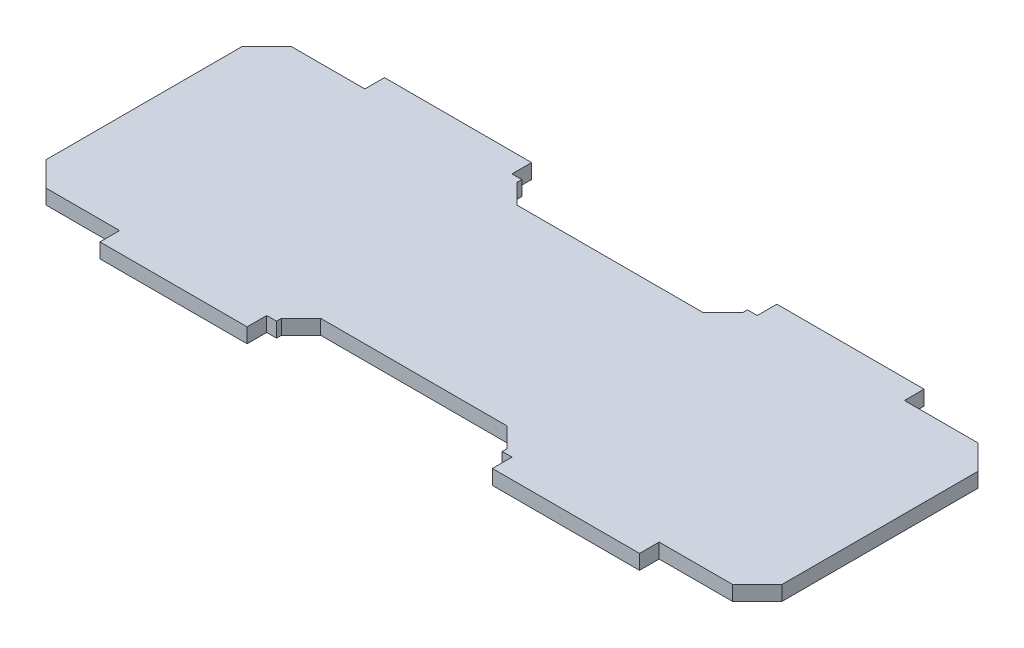
ISO-10303-21;
HEADER;
FILE_DESCRIPTION(('STEP AP214'),'2;1');
FILE_NAME('part.step','',(''),(''),'','','');
FILE_SCHEMA(('AUTOMOTIVE_DESIGN { 1 0 10303 214 1 1 1 1 }'));
ENDSEC;
DATA;
#1=APPLICATION_CONTEXT('core data for automotive mechanical design processes');
#2=APPLICATION_PROTOCOL_DEFINITION('international standard','automotive_design',2000,#1);
#3=PRODUCT_CONTEXT('',#1,'mechanical');
#4=PRODUCT('Part','Part','',(#3));
#5=PRODUCT_RELATED_PRODUCT_CATEGORY('part','',(#4));
#6=PRODUCT_DEFINITION_FORMATION('','',#4);
#7=PRODUCT_DEFINITION_CONTEXT('part definition',#1,'design');
#8=PRODUCT_DEFINITION('design','',#6,#7);
#9=PRODUCT_DEFINITION_SHAPE('','',#8);
#10=(LENGTH_UNIT() NAMED_UNIT(*) SI_UNIT(.MILLI.,.METRE.));
#11=(NAMED_UNIT(*) PLANE_ANGLE_UNIT() SI_UNIT($,.RADIAN.));
#12=(NAMED_UNIT(*) SI_UNIT($,.STERADIAN.) SOLID_ANGLE_UNIT());
#13=UNCERTAINTY_MEASURE_WITH_UNIT(LENGTH_MEASURE(1.E-05),#10,'distance_accuracy_value','');
#14=(GEOMETRIC_REPRESENTATION_CONTEXT(3) GLOBAL_UNCERTAINTY_ASSIGNED_CONTEXT((#13)) GLOBAL_UNIT_ASSIGNED_CONTEXT((#10,
#11,#12)) REPRESENTATION_CONTEXT('',''));
#15=CARTESIAN_POINT('',(0.,0.,0.));
#16=DIRECTION('',(0.,0.,1.));
#17=DIRECTION('',(1.,0.,0.));
#18=AXIS2_PLACEMENT_3D('',#15,#16,#17);
#19=CARTESIAN_POINT('',(-55.,3.,-25.));
#20=DIRECTION('',(1.,0.,0.));
#21=DIRECTION('',(0.,0.,-1.));
#22=AXIS2_PLACEMENT_3D('',#19,#20,#21);
#23=PLANE('',#22);
#24=DIRECTION('',(0.,0.,1.));
#25=VECTOR('',#24,1.);
#26=CARTESIAN_POINT('',(-55.,0.,-25.));
#27=LINE('',#26,#25);
#28=CARTESIAN_POINT('',(-55.,0.,-29.));
#29=VERTEX_POINT('',#28);
#30=CARTESIAN_POINT('',(-55.,0.,-25.));
#31=VERTEX_POINT('',#30);
#32=EDGE_CURVE('E312',#29,#31,#27,.T.);
#33=ORIENTED_EDGE('',*,*,#32,.T.);
#34=DIRECTION('',(0.,-1.,0.));
#35=VECTOR('',#34,1.);
#36=CARTESIAN_POINT('',(-55.,3.,-25.));
#37=LINE('',#36,#35);
#38=CARTESIAN_POINT('',(-55.,3.,-25.));
#39=VERTEX_POINT('',#38);
#40=EDGE_CURVE('E11',#39,#31,#37,.T.);
#41=ORIENTED_EDGE('',*,*,#40,.F.);
#42=DIRECTION('',(0.,0.,1.));
#43=VECTOR('',#42,1.);
#44=CARTESIAN_POINT('',(-55.,3.,-25.));
#45=LINE('',#44,#43);
#46=CARTESIAN_POINT('',(-55.,3.,-29.));
#47=VERTEX_POINT('',#46);
#48=EDGE_CURVE('E418',#47,#39,#45,.T.);
#49=ORIENTED_EDGE('',*,*,#48,.F.);
#50=DIRECTION('',(0.,-1.,0.));
#51=VECTOR('',#50,1.);
#52=CARTESIAN_POINT('',(-55.,3.,-29.));
#53=LINE('',#52,#51);
#54=EDGE_CURVE('E308',#47,#29,#53,.T.);
#55=ORIENTED_EDGE('',*,*,#54,.T.);
#56=EDGE_LOOP('',(#33,#41,#49,#55));
#57=FACE_BOUND('',#56,.T.);
#58=ADVANCED_FACE('F43',(#57),#23,.F.);
#59=CARTESIAN_POINT('',(-70.,3.,-25.));
#60=DIRECTION('',(0.,0.,1.));
#61=DIRECTION('',(1.,0.,0.));
#62=AXIS2_PLACEMENT_3D('',#59,#60,#61);
#63=PLANE('',#62);
#64=DIRECTION('',(-1.,0.,0.));
#65=VECTOR('',#64,1.);
#66=CARTESIAN_POINT('',(-70.,0.,-25.));
#67=LINE('',#66,#65);
#68=CARTESIAN_POINT('',(-70.,0.,-25.));
#69=VERTEX_POINT('',#68);
#70=EDGE_CURVE('E316',#31,#69,#67,.T.);
#71=ORIENTED_EDGE('',*,*,#70,.T.);
#72=DIRECTION('',(0.,-1.,0.));
#73=VECTOR('',#72,1.);
#74=CARTESIAN_POINT('',(-70.,3.,-25.));
#75=LINE('',#74,#73);
#76=CARTESIAN_POINT('',(-70.,3.,-25.));
#77=VERTEX_POINT('',#76);
#78=EDGE_CURVE('E52',#77,#69,#75,.T.);
#79=ORIENTED_EDGE('',*,*,#78,.F.);
#80=DIRECTION('',(-1.,0.,0.));
#81=VECTOR('',#80,1.);
#82=CARTESIAN_POINT('',(-70.,3.,-25.));
#83=LINE('',#82,#81);
#84=EDGE_CURVE('E187',#39,#77,#83,.T.);
#85=ORIENTED_EDGE('',*,*,#84,.F.);
#86=ORIENTED_EDGE('',*,*,#40,.T.);
#87=EDGE_LOOP('',(#71,#79,#85,#86));
#88=FACE_BOUND('',#87,.T.);
#89=ADVANCED_FACE('F680',(#88),#63,.F.);
#90=CARTESIAN_POINT('',(-75.,3.,-20.));
#91=DIRECTION('',(0.707106781186547,0.,0.707106781186548));
#92=DIRECTION('',(0.707106781186548,0.,-0.707106781186547));
#93=AXIS2_PLACEMENT_3D('',#90,#91,#92);
#94=PLANE('',#93);
#95=DIRECTION('',(-0.707106781186548,0.,0.707106781186547));
#96=VECTOR('',#95,1.);
#97=CARTESIAN_POINT('',(-75.,0.,-20.));
#98=LINE('',#97,#96);
#99=CARTESIAN_POINT('',(-75.,0.,-20.));
#100=VERTEX_POINT('',#99);
#101=EDGE_CURVE('E319',#69,#100,#98,.T.);
#102=ORIENTED_EDGE('',*,*,#101,.T.);
#103=DIRECTION('',(0.,-1.,0.));
#104=VECTOR('',#103,1.);
#105=CARTESIAN_POINT('',(-75.,3.,-20.));
#106=LINE('',#105,#104);
#107=CARTESIAN_POINT('',(-75.,3.,-20.));
#108=VERTEX_POINT('',#107);
#109=EDGE_CURVE('E541',#108,#100,#106,.T.);
#110=ORIENTED_EDGE('',*,*,#109,.F.);
#111=DIRECTION('',(-0.707106781186548,0.,0.707106781186547));
#112=VECTOR('',#111,1.);
#113=CARTESIAN_POINT('',(-75.,3.,-20.));
#114=LINE('',#113,#112);
#115=EDGE_CURVE('E551',#77,#108,#114,.T.);
#116=ORIENTED_EDGE('',*,*,#115,.F.);
#117=ORIENTED_EDGE('',*,*,#78,.T.);
#118=EDGE_LOOP('',(#102,#110,#116,#117));
#119=FACE_BOUND('',#118,.T.);
#120=ADVANCED_FACE('F549',(#119),#94,.F.);
#121=CARTESIAN_POINT('',(-75.,3.,20.));
#122=DIRECTION('',(1.,0.,0.));
#123=DIRECTION('',(0.,0.,-1.));
#124=AXIS2_PLACEMENT_3D('',#121,#122,#123);
#125=PLANE('',#124);
#126=DIRECTION('',(0.,0.,1.));
#127=VECTOR('',#126,1.);
#128=CARTESIAN_POINT('',(-75.,0.,20.));
#129=LINE('',#128,#127);
#130=CARTESIAN_POINT('',(-75.,0.,20.));
#131=VERTEX_POINT('',#130);
#132=EDGE_CURVE('E322',#100,#131,#129,.T.);
#133=ORIENTED_EDGE('',*,*,#132,.T.);
#134=DIRECTION('',(0.,-1.,0.));
#135=VECTOR('',#134,1.);
#136=CARTESIAN_POINT('',(-75.,3.,20.));
#137=LINE('',#136,#135);
#138=CARTESIAN_POINT('',(-75.,3.,20.));
#139=VERTEX_POINT('',#138);
#140=EDGE_CURVE('E537',#139,#131,#137,.T.);
#141=ORIENTED_EDGE('',*,*,#140,.F.);
#142=DIRECTION('',(0.,0.,1.));
#143=VECTOR('',#142,1.);
#144=CARTESIAN_POINT('',(-75.,3.,20.));
#145=LINE('',#144,#143);
#146=EDGE_CURVE('E570',#108,#139,#145,.T.);
#147=ORIENTED_EDGE('',*,*,#146,.F.);
#148=ORIENTED_EDGE('',*,*,#109,.T.);
#149=EDGE_LOOP('',(#133,#141,#147,#148));
#150=FACE_BOUND('',#149,.T.);
#151=ADVANCED_FACE('F560',(#150),#125,.F.);
#152=CARTESIAN_POINT('',(-75.,3.,20.));
#153=DIRECTION('',(0.707106781186547,0.,-0.707106781186548));
#154=DIRECTION('',(-0.707106781186548,0.,-0.707106781186547));
#155=AXIS2_PLACEMENT_3D('',#152,#153,#154);
#156=PLANE('',#155);
#157=DIRECTION('',(0.707106781186548,0.,0.707106781186547));
#158=VECTOR('',#157,1.);
#159=CARTESIAN_POINT('',(-75.,0.,20.));
#160=LINE('',#159,#158);
#161=CARTESIAN_POINT('',(-70.,0.,25.));
#162=VERTEX_POINT('',#161);
#163=EDGE_CURVE('E325',#131,#162,#160,.T.);
#164=ORIENTED_EDGE('',*,*,#163,.T.);
#165=DIRECTION('',(0.,-1.,0.));
#166=VECTOR('',#165,1.);
#167=CARTESIAN_POINT('',(-70.,3.,25.));
#168=LINE('',#167,#166);
#169=CARTESIAN_POINT('',(-70.,3.,25.));
#170=VERTEX_POINT('',#169);
#171=EDGE_CURVE('E533',#170,#162,#168,.T.);
#172=ORIENTED_EDGE('',*,*,#171,.F.);
#173=DIRECTION('',(0.707106781186548,0.,0.707106781186547));
#174=VECTOR('',#173,1.);
#175=CARTESIAN_POINT('',(-75.,3.,20.));
#176=LINE('',#175,#174);
#177=EDGE_CURVE('E566',#139,#170,#176,.T.);
#178=ORIENTED_EDGE('',*,*,#177,.F.);
#179=ORIENTED_EDGE('',*,*,#140,.T.);
#180=EDGE_LOOP('',(#164,#172,#178,#179));
#181=FACE_BOUND('',#180,.T.);
#182=ADVANCED_FACE('F564',(#181),#156,.F.);
#183=CARTESIAN_POINT('',(-70.,3.,25.));
#184=DIRECTION('',(0.,0.,-1.));
#185=DIRECTION('',(-1.,0.,0.));
#186=AXIS2_PLACEMENT_3D('',#183,#184,#185);
#187=PLANE('',#186);
#188=DIRECTION('',(1.,0.,0.));
#189=VECTOR('',#188,1.);
#190=CARTESIAN_POINT('',(-70.,0.,25.));
#191=LINE('',#190,#189);
#192=CARTESIAN_POINT('',(-55.,0.,25.));
#193=VERTEX_POINT('',#192);
#194=EDGE_CURVE('E328',#162,#193,#191,.T.);
#195=ORIENTED_EDGE('',*,*,#194,.T.);
#196=DIRECTION('',(0.,-1.,0.));
#197=VECTOR('',#196,1.);
#198=CARTESIAN_POINT('',(-55.,3.,25.));
#199=LINE('',#198,#197);
#200=CARTESIAN_POINT('',(-55.,3.,25.));
#201=VERTEX_POINT('',#200);
#202=EDGE_CURVE('E529',#201,#193,#199,.T.);
#203=ORIENTED_EDGE('',*,*,#202,.F.);
#204=DIRECTION('',(1.,0.,0.));
#205=VECTOR('',#204,1.);
#206=CARTESIAN_POINT('',(-70.,3.,25.));
#207=LINE('',#206,#205);
#208=EDGE_CURVE('E569',#170,#201,#207,.T.);
#209=ORIENTED_EDGE('',*,*,#208,.F.);
#210=ORIENTED_EDGE('',*,*,#171,.T.);
#211=EDGE_LOOP('',(#195,#203,#209,#210));
#212=FACE_BOUND('',#211,.T.);
#213=ADVANCED_FACE('F693',(#212),#187,.F.);
#214=CARTESIAN_POINT('',(-55.,3.,25.));
#215=DIRECTION('',(1.,0.,0.));
#216=DIRECTION('',(0.,0.,-1.));
#217=AXIS2_PLACEMENT_3D('',#214,#215,#216);
#218=PLANE('',#217);
#219=DIRECTION('',(0.,0.,1.));
#220=VECTOR('',#219,1.);
#221=CARTESIAN_POINT('',(-55.,0.,25.));
#222=LINE('',#221,#220);
#223=CARTESIAN_POINT('',(-55.,0.,29.));
#224=VERTEX_POINT('',#223);
#225=EDGE_CURVE('E331',#193,#224,#222,.T.);
#226=ORIENTED_EDGE('',*,*,#225,.T.);
#227=DIRECTION('',(0.,-1.,0.));
#228=VECTOR('',#227,1.);
#229=CARTESIAN_POINT('',(-55.,3.,29.));
#230=LINE('',#229,#228);
#231=CARTESIAN_POINT('',(-55.,3.,29.));
#232=VERTEX_POINT('',#231);
#233=EDGE_CURVE('E525',#232,#224,#230,.T.);
#234=ORIENTED_EDGE('',*,*,#233,.F.);
#235=DIRECTION('',(0.,0.,1.));
#236=VECTOR('',#235,1.);
#237=CARTESIAN_POINT('',(-55.,3.,25.));
#238=LINE('',#237,#236);
#239=EDGE_CURVE('E574',#201,#232,#238,.T.);
#240=ORIENTED_EDGE('',*,*,#239,.F.);
#241=ORIENTED_EDGE('',*,*,#202,.T.);
#242=EDGE_LOOP('',(#226,#234,#240,#241));
#243=FACE_BOUND('',#242,.T.);
#244=ADVANCED_FACE('F696',(#243),#218,.F.);
#245=CARTESIAN_POINT('',(-55.,3.,29.));
#246=DIRECTION('',(0.,0.,-1.));
#247=DIRECTION('',(-1.,0.,0.));
#248=AXIS2_PLACEMENT_3D('',#245,#246,#247);
#249=PLANE('',#248);
#250=DIRECTION('',(1.,0.,0.));
#251=VECTOR('',#250,1.);
#252=CARTESIAN_POINT('',(-55.,0.,29.));
#253=LINE('',#252,#251);
#254=CARTESIAN_POINT('',(-25.,0.,29.));
#255=VERTEX_POINT('',#254);
#256=EDGE_CURVE('E334',#224,#255,#253,.T.);
#257=ORIENTED_EDGE('',*,*,#256,.T.);
#258=DIRECTION('',(0.,-1.,0.));
#259=VECTOR('',#258,1.);
#260=CARTESIAN_POINT('',(-25.,3.,29.));
#261=LINE('',#260,#259);
#262=CARTESIAN_POINT('',(-25.,3.,29.));
#263=VERTEX_POINT('',#262);
#264=EDGE_CURVE('E521',#263,#255,#261,.T.);
#265=ORIENTED_EDGE('',*,*,#264,.F.);
#266=DIRECTION('',(1.,0.,0.));
#267=VECTOR('',#266,1.);
#268=CARTESIAN_POINT('',(-55.,3.,29.));
#269=LINE('',#268,#267);
#270=EDGE_CURVE('E581',#232,#263,#269,.T.);
#271=ORIENTED_EDGE('',*,*,#270,.F.);
#272=ORIENTED_EDGE('',*,*,#233,.T.);
#273=EDGE_LOOP('',(#257,#265,#271,#272));
#274=FACE_BOUND('',#273,.T.);
#275=ADVANCED_FACE('F700',(#274),#249,.F.);
#276=CARTESIAN_POINT('',(-25.,3.,25.));
#277=DIRECTION('',(-1.,0.,0.));
#278=DIRECTION('',(0.,0.,1.));
#279=AXIS2_PLACEMENT_3D('',#276,#277,#278);
#280=PLANE('',#279);
#281=DIRECTION('',(0.,0.,-1.));
#282=VECTOR('',#281,1.);
#283=CARTESIAN_POINT('',(-25.,0.,25.));
#284=LINE('',#283,#282);
#285=CARTESIAN_POINT('',(-25.,0.,25.));
#286=VERTEX_POINT('',#285);
#287=EDGE_CURVE('E337',#255,#286,#284,.T.);
#288=ORIENTED_EDGE('',*,*,#287,.T.);
#289=DIRECTION('',(0.,-1.,0.));
#290=VECTOR('',#289,1.);
#291=CARTESIAN_POINT('',(-25.,3.,25.));
#292=LINE('',#291,#290);
#293=CARTESIAN_POINT('',(-25.,3.,25.));
#294=VERTEX_POINT('',#293);
#295=EDGE_CURVE('E517',#294,#286,#292,.T.);
#296=ORIENTED_EDGE('',*,*,#295,.F.);
#297=DIRECTION('',(0.,0.,-1.));
#298=VECTOR('',#297,1.);
#299=CARTESIAN_POINT('',(-25.,3.,25.));
#300=LINE('',#299,#298);
#301=EDGE_CURVE('E584',#263,#294,#300,.T.);
#302=ORIENTED_EDGE('',*,*,#301,.F.);
#303=ORIENTED_EDGE('',*,*,#264,.T.);
#304=EDGE_LOOP('',(#288,#296,#302,#303));
#305=FACE_BOUND('',#304,.T.);
#306=ADVANCED_FACE('F704',(#305),#280,.F.);
#307=CARTESIAN_POINT('',(-25.,3.,25.));
#308=DIRECTION('',(0.,0.,-1.));
#309=DIRECTION('',(-1.,0.,0.));
#310=AXIS2_PLACEMENT_3D('',#307,#308,#309);
#311=PLANE('',#310);
#312=DIRECTION('',(1.,0.,0.));
#313=VECTOR('',#312,1.);
#314=CARTESIAN_POINT('',(-25.,0.,25.));
#315=LINE('',#314,#313);
#316=CARTESIAN_POINT('',(-23.,0.,25.));
#317=VERTEX_POINT('',#316);
#318=EDGE_CURVE('E340',#286,#317,#315,.T.);
#319=ORIENTED_EDGE('',*,*,#318,.T.);
#320=DIRECTION('',(0.,-1.,0.));
#321=VECTOR('',#320,1.);
#322=CARTESIAN_POINT('',(-23.,3.,25.));
#323=LINE('',#322,#321);
#324=CARTESIAN_POINT('',(-23.,3.,25.));
#325=VERTEX_POINT('',#324);
#326=EDGE_CURVE('E513',#325,#317,#323,.T.);
#327=ORIENTED_EDGE('',*,*,#326,.F.);
#328=DIRECTION('',(1.,0.,0.));
#329=VECTOR('',#328,1.);
#330=CARTESIAN_POINT('',(-25.,3.,25.));
#331=LINE('',#330,#329);
#332=EDGE_CURVE('E587',#294,#325,#331,.T.);
#333=ORIENTED_EDGE('',*,*,#332,.F.);
#334=ORIENTED_EDGE('',*,*,#295,.T.);
#335=EDGE_LOOP('',(#319,#327,#333,#334));
#336=FACE_BOUND('',#335,.T.);
#337=ADVANCED_FACE('F708',(#336),#311,.F.);
#338=CARTESIAN_POINT('',(-23.,3.,25.));
#339=DIRECTION('',(-1.,0.,0.));
#340=DIRECTION('',(0.,0.,1.));
#341=AXIS2_PLACEMENT_3D('',#338,#339,#340);
#342=PLANE('',#341);
#343=DIRECTION('',(0.,0.,-1.));
#344=VECTOR('',#343,1.);
#345=CARTESIAN_POINT('',(-23.,0.,25.));
#346=LINE('',#345,#344);
#347=CARTESIAN_POINT('',(-23.,0.,24.));
#348=VERTEX_POINT('',#347);
#349=EDGE_CURVE('E343',#317,#348,#346,.T.);
#350=ORIENTED_EDGE('',*,*,#349,.T.);
#351=DIRECTION('',(0.,-1.,0.));
#352=VECTOR('',#351,1.);
#353=CARTESIAN_POINT('',(-23.,3.,24.));
#354=LINE('',#353,#352);
#355=CARTESIAN_POINT('',(-23.,3.,24.));
#356=VERTEX_POINT('',#355);
#357=EDGE_CURVE('E509',#356,#348,#354,.T.);
#358=ORIENTED_EDGE('',*,*,#357,.F.);
#359=DIRECTION('',(0.,0.,-1.));
#360=VECTOR('',#359,1.);
#361=CARTESIAN_POINT('',(-23.,3.,25.));
#362=LINE('',#361,#360);
#363=EDGE_CURVE('E590',#325,#356,#362,.T.);
#364=ORIENTED_EDGE('',*,*,#363,.F.);
#365=ORIENTED_EDGE('',*,*,#326,.T.);
#366=EDGE_LOOP('',(#350,#358,#364,#365));
#367=FACE_BOUND('',#366,.T.);
#368=ADVANCED_FACE('F712',(#367),#342,.F.);
#369=CARTESIAN_POINT('',(-23.,3.,24.));
#370=DIRECTION('',(-0.707106781186547,0.,-0.707106781186547));
#371=DIRECTION('',(-0.707106781186548,0.,0.707106781186548));
#372=AXIS2_PLACEMENT_3D('',#369,#370,#371);
#373=PLANE('',#372);
#374=DIRECTION('',(0.707106781186548,0.,-0.707106781186548));
#375=VECTOR('',#374,1.);
#376=CARTESIAN_POINT('',(-23.,0.,24.));
#377=LINE('',#376,#375);
#378=CARTESIAN_POINT('',(-19.,0.,20.));
#379=VERTEX_POINT('',#378);
#380=EDGE_CURVE('E346',#348,#379,#377,.T.);
#381=ORIENTED_EDGE('',*,*,#380,.T.);
#382=DIRECTION('',(0.,-1.,0.));
#383=VECTOR('',#382,1.);
#384=CARTESIAN_POINT('',(-19.,3.,20.));
#385=LINE('',#384,#383);
#386=CARTESIAN_POINT('',(-19.,3.,20.));
#387=VERTEX_POINT('',#386);
#388=EDGE_CURVE('E505',#387,#379,#385,.T.);
#389=ORIENTED_EDGE('',*,*,#388,.F.);
#390=DIRECTION('',(0.707106781186548,0.,-0.707106781186548));
#391=VECTOR('',#390,1.);
#392=CARTESIAN_POINT('',(-23.,3.,24.));
#393=LINE('',#392,#391);
#394=EDGE_CURVE('E593',#356,#387,#393,.T.);
#395=ORIENTED_EDGE('',*,*,#394,.F.);
#396=ORIENTED_EDGE('',*,*,#357,.T.);
#397=EDGE_LOOP('',(#381,#389,#395,#396));
#398=FACE_BOUND('',#397,.T.);
#399=ADVANCED_FACE('F716',(#398),#373,.F.);
#400=CARTESIAN_POINT('',(-19.,3.,20.));
#401=DIRECTION('',(0.,0.,-1.));
#402=DIRECTION('',(-1.,0.,0.));
#403=AXIS2_PLACEMENT_3D('',#400,#401,#402);
#404=PLANE('',#403);
#405=DIRECTION('',(1.,0.,0.));
#406=VECTOR('',#405,1.);
#407=CARTESIAN_POINT('',(-19.,0.,20.));
#408=LINE('',#407,#406);
#409=CARTESIAN_POINT('',(19.,0.,20.));
#410=VERTEX_POINT('',#409);
#411=EDGE_CURVE('E349',#379,#410,#408,.T.);
#412=ORIENTED_EDGE('',*,*,#411,.T.);
#413=DIRECTION('',(0.,-1.,0.));
#414=VECTOR('',#413,1.);
#415=CARTESIAN_POINT('',(19.,3.,20.));
#416=LINE('',#415,#414);
#417=CARTESIAN_POINT('',(19.,3.,20.));
#418=VERTEX_POINT('',#417);
#419=EDGE_CURVE('E501',#418,#410,#416,.T.);
#420=ORIENTED_EDGE('',*,*,#419,.F.);
#421=DIRECTION('',(1.,0.,0.));
#422=VECTOR('',#421,1.);
#423=CARTESIAN_POINT('',(-19.,3.,20.));
#424=LINE('',#423,#422);
#425=EDGE_CURVE('E596',#387,#418,#424,.T.);
#426=ORIENTED_EDGE('',*,*,#425,.F.);
#427=ORIENTED_EDGE('',*,*,#388,.T.);
#428=EDGE_LOOP('',(#412,#420,#426,#427));
#429=FACE_BOUND('',#428,.T.);
#430=ADVANCED_FACE('F720',(#429),#404,.F.);
#431=CARTESIAN_POINT('',(19.,3.,20.));
#432=DIRECTION('',(0.707106781186547,0.,-0.707106781186548));
#433=DIRECTION('',(-0.707106781186548,0.,-0.707106781186547));
#434=AXIS2_PLACEMENT_3D('',#431,#432,#433);
#435=PLANE('',#434);
#436=DIRECTION('',(0.707106781186548,0.,0.707106781186547));
#437=VECTOR('',#436,1.);
#438=CARTESIAN_POINT('',(19.,0.,20.));
#439=LINE('',#438,#437);
#440=CARTESIAN_POINT('',(23.,0.,24.));
#441=VERTEX_POINT('',#440);
#442=EDGE_CURVE('E352',#410,#441,#439,.T.);
#443=ORIENTED_EDGE('',*,*,#442,.T.);
#444=DIRECTION('',(0.,-1.,0.));
#445=VECTOR('',#444,1.);
#446=CARTESIAN_POINT('',(23.,3.,24.));
#447=LINE('',#446,#445);
#448=CARTESIAN_POINT('',(23.,3.,24.));
#449=VERTEX_POINT('',#448);
#450=EDGE_CURVE('E497',#449,#441,#447,.T.);
#451=ORIENTED_EDGE('',*,*,#450,.F.);
#452=DIRECTION('',(0.707106781186548,0.,0.707106781186547));
#453=VECTOR('',#452,1.);
#454=CARTESIAN_POINT('',(19.,3.,20.));
#455=LINE('',#454,#453);
#456=EDGE_CURVE('E599',#418,#449,#455,.T.);
#457=ORIENTED_EDGE('',*,*,#456,.F.);
#458=ORIENTED_EDGE('',*,*,#419,.T.);
#459=EDGE_LOOP('',(#443,#451,#457,#458));
#460=FACE_BOUND('',#459,.T.);
#461=ADVANCED_FACE('F724',(#460),#435,.F.);
#462=CARTESIAN_POINT('',(23.,3.,24.));
#463=DIRECTION('',(1.,0.,0.));
#464=DIRECTION('',(0.,0.,-1.));
#465=AXIS2_PLACEMENT_3D('',#462,#463,#464);
#466=PLANE('',#465);
#467=DIRECTION('',(0.,0.,1.));
#468=VECTOR('',#467,1.);
#469=CARTESIAN_POINT('',(23.,0.,24.));
#470=LINE('',#469,#468);
#471=CARTESIAN_POINT('',(23.,0.,25.));
#472=VERTEX_POINT('',#471);
#473=EDGE_CURVE('E355',#441,#472,#470,.T.);
#474=ORIENTED_EDGE('',*,*,#473,.T.);
#475=DIRECTION('',(0.,-1.,0.));
#476=VECTOR('',#475,1.);
#477=CARTESIAN_POINT('',(23.,3.,25.));
#478=LINE('',#477,#476);
#479=CARTESIAN_POINT('',(23.,3.,25.));
#480=VERTEX_POINT('',#479);
#481=EDGE_CURVE('E493',#480,#472,#478,.T.);
#482=ORIENTED_EDGE('',*,*,#481,.F.);
#483=DIRECTION('',(0.,0.,1.));
#484=VECTOR('',#483,1.);
#485=CARTESIAN_POINT('',(23.,3.,24.));
#486=LINE('',#485,#484);
#487=EDGE_CURVE('E602',#449,#480,#486,.T.);
#488=ORIENTED_EDGE('',*,*,#487,.F.);
#489=ORIENTED_EDGE('',*,*,#450,.T.);
#490=EDGE_LOOP('',(#474,#482,#488,#489));
#491=FACE_BOUND('',#490,.T.);
#492=ADVANCED_FACE('F728',(#491),#466,.F.);
#493=CARTESIAN_POINT('',(23.,3.,25.));
#494=DIRECTION('',(0.,0.,-1.));
#495=DIRECTION('',(-1.,0.,0.));
#496=AXIS2_PLACEMENT_3D('',#493,#494,#495);
#497=PLANE('',#496);
#498=DIRECTION('',(1.,0.,0.));
#499=VECTOR('',#498,1.);
#500=CARTESIAN_POINT('',(23.,0.,25.));
#501=LINE('',#500,#499);
#502=CARTESIAN_POINT('',(25.,0.,25.));
#503=VERTEX_POINT('',#502);
#504=EDGE_CURVE('E358',#472,#503,#501,.T.);
#505=ORIENTED_EDGE('',*,*,#504,.T.);
#506=DIRECTION('',(0.,-1.,0.));
#507=VECTOR('',#506,1.);
#508=CARTESIAN_POINT('',(25.,3.,25.));
#509=LINE('',#508,#507);
#510=CARTESIAN_POINT('',(25.,3.,25.));
#511=VERTEX_POINT('',#510);
#512=EDGE_CURVE('E489',#511,#503,#509,.T.);
#513=ORIENTED_EDGE('',*,*,#512,.F.);
#514=DIRECTION('',(1.,0.,0.));
#515=VECTOR('',#514,1.);
#516=CARTESIAN_POINT('',(23.,3.,25.));
#517=LINE('',#516,#515);
#518=EDGE_CURVE('E605',#480,#511,#517,.T.);
#519=ORIENTED_EDGE('',*,*,#518,.F.);
#520=ORIENTED_EDGE('',*,*,#481,.T.);
#521=EDGE_LOOP('',(#505,#513,#519,#520));
#522=FACE_BOUND('',#521,.T.);
#523=ADVANCED_FACE('F732',(#522),#497,.F.);
#524=CARTESIAN_POINT('',(25.,3.,25.));
#525=DIRECTION('',(1.,0.,0.));
#526=DIRECTION('',(0.,0.,-1.));
#527=AXIS2_PLACEMENT_3D('',#524,#525,#526);
#528=PLANE('',#527);
#529=DIRECTION('',(0.,0.,1.));
#530=VECTOR('',#529,1.);
#531=CARTESIAN_POINT('',(25.,0.,25.));
#532=LINE('',#531,#530);
#533=CARTESIAN_POINT('',(25.,0.,29.));
#534=VERTEX_POINT('',#533);
#535=EDGE_CURVE('E361',#503,#534,#532,.T.);
#536=ORIENTED_EDGE('',*,*,#535,.T.);
#537=DIRECTION('',(0.,-1.,0.));
#538=VECTOR('',#537,1.);
#539=CARTESIAN_POINT('',(25.,3.,29.));
#540=LINE('',#539,#538);
#541=CARTESIAN_POINT('',(25.,3.,29.));
#542=VERTEX_POINT('',#541);
#543=EDGE_CURVE('E485',#542,#534,#540,.T.);
#544=ORIENTED_EDGE('',*,*,#543,.F.);
#545=DIRECTION('',(0.,0.,1.));
#546=VECTOR('',#545,1.);
#547=CARTESIAN_POINT('',(25.,3.,25.));
#548=LINE('',#547,#546);
#549=EDGE_CURVE('E608',#511,#542,#548,.T.);
#550=ORIENTED_EDGE('',*,*,#549,.F.);
#551=ORIENTED_EDGE('',*,*,#512,.T.);
#552=EDGE_LOOP('',(#536,#544,#550,#551));
#553=FACE_BOUND('',#552,.T.);
#554=ADVANCED_FACE('F736',(#553),#528,.F.);
#555=CARTESIAN_POINT('',(25.,3.,29.));
#556=DIRECTION('',(0.,0.,-1.));
#557=DIRECTION('',(-1.,0.,0.));
#558=AXIS2_PLACEMENT_3D('',#555,#556,#557);
#559=PLANE('',#558);
#560=DIRECTION('',(1.,0.,0.));
#561=VECTOR('',#560,1.);
#562=CARTESIAN_POINT('',(25.,0.,29.));
#563=LINE('',#562,#561);
#564=CARTESIAN_POINT('',(55.,0.,29.));
#565=VERTEX_POINT('',#564);
#566=EDGE_CURVE('E364',#534,#565,#563,.T.);
#567=ORIENTED_EDGE('',*,*,#566,.T.);
#568=DIRECTION('',(0.,-1.,0.));
#569=VECTOR('',#568,1.);
#570=CARTESIAN_POINT('',(55.,3.,29.));
#571=LINE('',#570,#569);
#572=CARTESIAN_POINT('',(55.,3.,29.));
#573=VERTEX_POINT('',#572);
#574=EDGE_CURVE('E481',#573,#565,#571,.T.);
#575=ORIENTED_EDGE('',*,*,#574,.F.);
#576=DIRECTION('',(1.,0.,0.));
#577=VECTOR('',#576,1.);
#578=CARTESIAN_POINT('',(25.,3.,29.));
#579=LINE('',#578,#577);
#580=EDGE_CURVE('E611',#542,#573,#579,.T.);
#581=ORIENTED_EDGE('',*,*,#580,.F.);
#582=ORIENTED_EDGE('',*,*,#543,.T.);
#583=EDGE_LOOP('',(#567,#575,#581,#582));
#584=FACE_BOUND('',#583,.T.);
#585=ADVANCED_FACE('F740',(#584),#559,.F.);
#586=CARTESIAN_POINT('',(55.,3.,25.));
#587=DIRECTION('',(-1.,0.,0.));
#588=DIRECTION('',(0.,0.,1.));
#589=AXIS2_PLACEMENT_3D('',#586,#587,#588);
#590=PLANE('',#589);
#591=DIRECTION('',(0.,0.,-1.));
#592=VECTOR('',#591,1.);
#593=CARTESIAN_POINT('',(55.,0.,25.));
#594=LINE('',#593,#592);
#595=CARTESIAN_POINT('',(55.,0.,25.));
#596=VERTEX_POINT('',#595);
#597=EDGE_CURVE('E367',#565,#596,#594,.T.);
#598=ORIENTED_EDGE('',*,*,#597,.T.);
#599=DIRECTION('',(0.,-1.,0.));
#600=VECTOR('',#599,1.);
#601=CARTESIAN_POINT('',(55.,3.,25.));
#602=LINE('',#601,#600);
#603=CARTESIAN_POINT('',(55.,3.,25.));
#604=VERTEX_POINT('',#603);
#605=EDGE_CURVE('E477',#604,#596,#602,.T.);
#606=ORIENTED_EDGE('',*,*,#605,.F.);
#607=DIRECTION('',(0.,0.,-1.));
#608=VECTOR('',#607,1.);
#609=CARTESIAN_POINT('',(55.,3.,25.));
#610=LINE('',#609,#608);
#611=EDGE_CURVE('E614',#573,#604,#610,.T.);
#612=ORIENTED_EDGE('',*,*,#611,.F.);
#613=ORIENTED_EDGE('',*,*,#574,.T.);
#614=EDGE_LOOP('',(#598,#606,#612,#613));
#615=FACE_BOUND('',#614,.T.);
#616=ADVANCED_FACE('F744',(#615),#590,.F.);
#617=CARTESIAN_POINT('',(55.,3.,25.));
#618=DIRECTION('',(0.,0.,-1.));
#619=DIRECTION('',(-1.,0.,0.));
#620=AXIS2_PLACEMENT_3D('',#617,#618,#619);
#621=PLANE('',#620);
#622=DIRECTION('',(1.,0.,0.));
#623=VECTOR('',#622,1.);
#624=CARTESIAN_POINT('',(55.,0.,25.));
#625=LINE('',#624,#623);
#626=CARTESIAN_POINT('',(70.,0.,25.));
#627=VERTEX_POINT('',#626);
#628=EDGE_CURVE('E370',#596,#627,#625,.T.);
#629=ORIENTED_EDGE('',*,*,#628,.T.);
#630=DIRECTION('',(0.,-1.,0.));
#631=VECTOR('',#630,1.);
#632=CARTESIAN_POINT('',(70.,3.,25.));
#633=LINE('',#632,#631);
#634=CARTESIAN_POINT('',(70.,3.,25.));
#635=VERTEX_POINT('',#634);
#636=EDGE_CURVE('E473',#635,#627,#633,.T.);
#637=ORIENTED_EDGE('',*,*,#636,.F.);
#638=DIRECTION('',(1.,0.,0.));
#639=VECTOR('',#638,1.);
#640=CARTESIAN_POINT('',(55.,3.,25.));
#641=LINE('',#640,#639);
#642=EDGE_CURVE('E617',#604,#635,#641,.T.);
#643=ORIENTED_EDGE('',*,*,#642,.F.);
#644=ORIENTED_EDGE('',*,*,#605,.T.);
#645=EDGE_LOOP('',(#629,#637,#643,#644));
#646=FACE_BOUND('',#645,.T.);
#647=ADVANCED_FACE('F748',(#646),#621,.F.);
#648=CARTESIAN_POINT('',(70.,3.,25.));
#649=DIRECTION('',(-0.707106781186547,0.,-0.707106781186548));
#650=DIRECTION('',(-0.707106781186548,0.,0.707106781186547));
#651=AXIS2_PLACEMENT_3D('',#648,#649,#650);
#652=PLANE('',#651);
#653=DIRECTION('',(0.707106781186548,0.,-0.707106781186547));
#654=VECTOR('',#653,1.);
#655=CARTESIAN_POINT('',(70.,0.,25.));
#656=LINE('',#655,#654);
#657=CARTESIAN_POINT('',(75.,0.,20.));
#658=VERTEX_POINT('',#657);
#659=EDGE_CURVE('E373',#627,#658,#656,.T.);
#660=ORIENTED_EDGE('',*,*,#659,.T.);
#661=DIRECTION('',(0.,-1.,0.));
#662=VECTOR('',#661,1.);
#663=CARTESIAN_POINT('',(75.,3.,20.));
#664=LINE('',#663,#662);
#665=CARTESIAN_POINT('',(75.,3.,20.));
#666=VERTEX_POINT('',#665);
#667=EDGE_CURVE('E469',#666,#658,#664,.T.);
#668=ORIENTED_EDGE('',*,*,#667,.F.);
#669=DIRECTION('',(0.707106781186548,0.,-0.707106781186547));
#670=VECTOR('',#669,1.);
#671=CARTESIAN_POINT('',(70.,3.,25.));
#672=LINE('',#671,#670);
#673=EDGE_CURVE('E620',#635,#666,#672,.T.);
#674=ORIENTED_EDGE('',*,*,#673,.F.);
#675=ORIENTED_EDGE('',*,*,#636,.T.);
#676=EDGE_LOOP('',(#660,#668,#674,#675));
#677=FACE_BOUND('',#676,.T.);
#678=ADVANCED_FACE('F752',(#677),#652,.F.);
#679=CARTESIAN_POINT('',(75.,3.,20.));
#680=DIRECTION('',(-1.,0.,0.));
#681=DIRECTION('',(0.,0.,1.));
#682=AXIS2_PLACEMENT_3D('',#679,#680,#681);
#683=PLANE('',#682);
#684=DIRECTION('',(0.,0.,-1.));
#685=VECTOR('',#684,1.);
#686=CARTESIAN_POINT('',(75.,0.,20.));
#687=LINE('',#686,#685);
#688=CARTESIAN_POINT('',(75.,0.,-20.));
#689=VERTEX_POINT('',#688);
#690=EDGE_CURVE('E376',#658,#689,#687,.T.);
#691=ORIENTED_EDGE('',*,*,#690,.T.);
#692=DIRECTION('',(0.,-1.,0.));
#693=VECTOR('',#692,1.);
#694=CARTESIAN_POINT('',(75.,3.,-20.));
#695=LINE('',#694,#693);
#696=CARTESIAN_POINT('',(75.,3.,-20.));
#697=VERTEX_POINT('',#696);
#698=EDGE_CURVE('E465',#697,#689,#695,.T.);
#699=ORIENTED_EDGE('',*,*,#698,.F.);
#700=DIRECTION('',(0.,0.,-1.));
#701=VECTOR('',#700,1.);
#702=CARTESIAN_POINT('',(75.,3.,20.));
#703=LINE('',#702,#701);
#704=EDGE_CURVE('E623',#666,#697,#703,.T.);
#705=ORIENTED_EDGE('',*,*,#704,.F.);
#706=ORIENTED_EDGE('',*,*,#667,.T.);
#707=EDGE_LOOP('',(#691,#699,#705,#706));
#708=FACE_BOUND('',#707,.T.);
#709=ADVANCED_FACE('F756',(#708),#683,.F.);
#710=CARTESIAN_POINT('',(70.,3.,-25.));
#711=DIRECTION('',(-0.707106781186547,0.,0.707106781186548));
#712=DIRECTION('',(0.707106781186548,0.,0.707106781186547));
#713=AXIS2_PLACEMENT_3D('',#710,#711,#712);
#714=PLANE('',#713);
#715=DIRECTION('',(-0.707106781186548,0.,-0.707106781186547));
#716=VECTOR('',#715,1.);
#717=CARTESIAN_POINT('',(70.,0.,-25.));
#718=LINE('',#717,#716);
#719=CARTESIAN_POINT('',(70.,0.,-25.));
#720=VERTEX_POINT('',#719);
#721=EDGE_CURVE('E379',#689,#720,#718,.T.);
#722=ORIENTED_EDGE('',*,*,#721,.T.);
#723=DIRECTION('',(0.,-1.,0.));
#724=VECTOR('',#723,1.);
#725=CARTESIAN_POINT('',(70.,3.,-25.));
#726=LINE('',#725,#724);
#727=CARTESIAN_POINT('',(70.,3.,-25.));
#728=VERTEX_POINT('',#727);
#729=EDGE_CURVE('E461',#728,#720,#726,.T.);
#730=ORIENTED_EDGE('',*,*,#729,.F.);
#731=DIRECTION('',(-0.707106781186548,0.,-0.707106781186547));
#732=VECTOR('',#731,1.);
#733=CARTESIAN_POINT('',(70.,3.,-25.));
#734=LINE('',#733,#732);
#735=EDGE_CURVE('E626',#697,#728,#734,.T.);
#736=ORIENTED_EDGE('',*,*,#735,.F.);
#737=ORIENTED_EDGE('',*,*,#698,.T.);
#738=EDGE_LOOP('',(#722,#730,#736,#737));
#739=FACE_BOUND('',#738,.T.);
#740=ADVANCED_FACE('F760',(#739),#714,.F.);
#741=CARTESIAN_POINT('',(55.,3.,-25.));
#742=DIRECTION('',(0.,0.,1.));
#743=DIRECTION('',(1.,0.,0.));
#744=AXIS2_PLACEMENT_3D('',#741,#742,#743);
#745=PLANE('',#744);
#746=DIRECTION('',(-1.,0.,0.));
#747=VECTOR('',#746,1.);
#748=CARTESIAN_POINT('',(55.,0.,-25.));
#749=LINE('',#748,#747);
#750=CARTESIAN_POINT('',(55.,0.,-25.));
#751=VERTEX_POINT('',#750);
#752=EDGE_CURVE('E382',#720,#751,#749,.T.);
#753=ORIENTED_EDGE('',*,*,#752,.T.);
#754=DIRECTION('',(0.,-1.,0.));
#755=VECTOR('',#754,1.);
#756=CARTESIAN_POINT('',(55.,3.,-25.));
#757=LINE('',#756,#755);
#758=CARTESIAN_POINT('',(55.,3.,-25.));
#759=VERTEX_POINT('',#758);
#760=EDGE_CURVE('E457',#759,#751,#757,.T.);
#761=ORIENTED_EDGE('',*,*,#760,.F.);
#762=DIRECTION('',(-1.,0.,0.));
#763=VECTOR('',#762,1.);
#764=CARTESIAN_POINT('',(55.,3.,-25.));
#765=LINE('',#764,#763);
#766=EDGE_CURVE('E629',#728,#759,#765,.T.);
#767=ORIENTED_EDGE('',*,*,#766,.F.);
#768=ORIENTED_EDGE('',*,*,#729,.T.);
#769=EDGE_LOOP('',(#753,#761,#767,#768));
#770=FACE_BOUND('',#769,.T.);
#771=ADVANCED_FACE('F764',(#770),#745,.F.);
#772=CARTESIAN_POINT('',(55.,3.,-25.));
#773=DIRECTION('',(-1.,0.,0.));
#774=DIRECTION('',(0.,0.,1.));
#775=AXIS2_PLACEMENT_3D('',#772,#773,#774);
#776=PLANE('',#775);
#777=DIRECTION('',(0.,0.,-1.));
#778=VECTOR('',#777,1.);
#779=CARTESIAN_POINT('',(55.,0.,-25.));
#780=LINE('',#779,#778);
#781=CARTESIAN_POINT('',(55.,0.,-29.));
#782=VERTEX_POINT('',#781);
#783=EDGE_CURVE('E385',#751,#782,#780,.T.);
#784=ORIENTED_EDGE('',*,*,#783,.T.);
#785=DIRECTION('',(0.,-1.,0.));
#786=VECTOR('',#785,1.);
#787=CARTESIAN_POINT('',(55.,3.,-29.));
#788=LINE('',#787,#786);
#789=CARTESIAN_POINT('',(55.,3.,-29.));
#790=VERTEX_POINT('',#789);
#791=EDGE_CURVE('E453',#790,#782,#788,.T.);
#792=ORIENTED_EDGE('',*,*,#791,.F.);
#793=DIRECTION('',(0.,0.,-1.));
#794=VECTOR('',#793,1.);
#795=CARTESIAN_POINT('',(55.,3.,-25.));
#796=LINE('',#795,#794);
#797=EDGE_CURVE('E632',#759,#790,#796,.T.);
#798=ORIENTED_EDGE('',*,*,#797,.F.);
#799=ORIENTED_EDGE('',*,*,#760,.T.);
#800=EDGE_LOOP('',(#784,#792,#798,#799));
#801=FACE_BOUND('',#800,.T.);
#802=ADVANCED_FACE('F768',(#801),#776,.F.);
#803=CARTESIAN_POINT('',(25.,3.,-29.));
#804=DIRECTION('',(0.,0.,1.));
#805=DIRECTION('',(1.,0.,0.));
#806=AXIS2_PLACEMENT_3D('',#803,#804,#805);
#807=PLANE('',#806);
#808=DIRECTION('',(-1.,0.,0.));
#809=VECTOR('',#808,1.);
#810=CARTESIAN_POINT('',(25.,0.,-29.));
#811=LINE('',#810,#809);
#812=CARTESIAN_POINT('',(25.,0.,-29.));
#813=VERTEX_POINT('',#812);
#814=EDGE_CURVE('E388',#782,#813,#811,.T.);
#815=ORIENTED_EDGE('',*,*,#814,.T.);
#816=DIRECTION('',(0.,-1.,0.));
#817=VECTOR('',#816,1.);
#818=CARTESIAN_POINT('',(25.,3.,-29.));
#819=LINE('',#818,#817);
#820=CARTESIAN_POINT('',(25.,3.,-29.));
#821=VERTEX_POINT('',#820);
#822=EDGE_CURVE('E449',#821,#813,#819,.T.);
#823=ORIENTED_EDGE('',*,*,#822,.F.);
#824=DIRECTION('',(-1.,0.,0.));
#825=VECTOR('',#824,1.);
#826=CARTESIAN_POINT('',(25.,3.,-29.));
#827=LINE('',#826,#825);
#828=EDGE_CURVE('E635',#790,#821,#827,.T.);
#829=ORIENTED_EDGE('',*,*,#828,.F.);
#830=ORIENTED_EDGE('',*,*,#791,.T.);
#831=EDGE_LOOP('',(#815,#823,#829,#830));
#832=FACE_BOUND('',#831,.T.);
#833=ADVANCED_FACE('F772',(#832),#807,.F.);
#834=CARTESIAN_POINT('',(25.,3.,-25.));
#835=DIRECTION('',(1.,0.,0.));
#836=DIRECTION('',(0.,0.,-1.));
#837=AXIS2_PLACEMENT_3D('',#834,#835,#836);
#838=PLANE('',#837);
#839=DIRECTION('',(0.,0.,1.));
#840=VECTOR('',#839,1.);
#841=CARTESIAN_POINT('',(25.,0.,-25.));
#842=LINE('',#841,#840);
#843=CARTESIAN_POINT('',(25.,0.,-25.));
#844=VERTEX_POINT('',#843);
#845=EDGE_CURVE('E391',#813,#844,#842,.T.);
#846=ORIENTED_EDGE('',*,*,#845,.T.);
#847=DIRECTION('',(0.,-1.,0.));
#848=VECTOR('',#847,1.);
#849=CARTESIAN_POINT('',(25.,3.,-25.));
#850=LINE('',#849,#848);
#851=CARTESIAN_POINT('',(25.,3.,-25.));
#852=VERTEX_POINT('',#851);
#853=EDGE_CURVE('E445',#852,#844,#850,.T.);
#854=ORIENTED_EDGE('',*,*,#853,.F.);
#855=DIRECTION('',(0.,0.,1.));
#856=VECTOR('',#855,1.);
#857=CARTESIAN_POINT('',(25.,3.,-25.));
#858=LINE('',#857,#856);
#859=EDGE_CURVE('E638',#821,#852,#858,.T.);
#860=ORIENTED_EDGE('',*,*,#859,.F.);
#861=ORIENTED_EDGE('',*,*,#822,.T.);
#862=EDGE_LOOP('',(#846,#854,#860,#861));
#863=FACE_BOUND('',#862,.T.);
#864=ADVANCED_FACE('F776',(#863),#838,.F.);
#865=CARTESIAN_POINT('',(23.,3.,-25.));
#866=DIRECTION('',(0.,0.,1.));
#867=DIRECTION('',(1.,0.,0.));
#868=AXIS2_PLACEMENT_3D('',#865,#866,#867);
#869=PLANE('',#868);
#870=DIRECTION('',(-1.,0.,0.));
#871=VECTOR('',#870,1.);
#872=CARTESIAN_POINT('',(23.,0.,-25.));
#873=LINE('',#872,#871);
#874=CARTESIAN_POINT('',(23.,0.,-25.));
#875=VERTEX_POINT('',#874);
#876=EDGE_CURVE('E394',#844,#875,#873,.T.);
#877=ORIENTED_EDGE('',*,*,#876,.T.);
#878=DIRECTION('',(0.,-1.,0.));
#879=VECTOR('',#878,1.);
#880=CARTESIAN_POINT('',(23.,3.,-25.));
#881=LINE('',#880,#879);
#882=CARTESIAN_POINT('',(23.,3.,-25.));
#883=VERTEX_POINT('',#882);
#884=EDGE_CURVE('E441',#883,#875,#881,.T.);
#885=ORIENTED_EDGE('',*,*,#884,.F.);
#886=DIRECTION('',(-1.,0.,0.));
#887=VECTOR('',#886,1.);
#888=CARTESIAN_POINT('',(23.,3.,-25.));
#889=LINE('',#888,#887);
#890=EDGE_CURVE('E641',#852,#883,#889,.T.);
#891=ORIENTED_EDGE('',*,*,#890,.F.);
#892=ORIENTED_EDGE('',*,*,#853,.T.);
#893=EDGE_LOOP('',(#877,#885,#891,#892));
#894=FACE_BOUND('',#893,.T.);
#895=ADVANCED_FACE('F780',(#894),#869,.F.);
#896=CARTESIAN_POINT('',(23.,3.,-24.));
#897=DIRECTION('',(1.,0.,0.));
#898=DIRECTION('',(0.,0.,-1.));
#899=AXIS2_PLACEMENT_3D('',#896,#897,#898);
#900=PLANE('',#899);
#901=DIRECTION('',(0.,0.,1.));
#902=VECTOR('',#901,1.);
#903=CARTESIAN_POINT('',(23.,0.,-24.));
#904=LINE('',#903,#902);
#905=CARTESIAN_POINT('',(23.,0.,-24.));
#906=VERTEX_POINT('',#905);
#907=EDGE_CURVE('E397',#875,#906,#904,.T.);
#908=ORIENTED_EDGE('',*,*,#907,.T.);
#909=DIRECTION('',(0.,-1.,0.));
#910=VECTOR('',#909,1.);
#911=CARTESIAN_POINT('',(23.,3.,-24.));
#912=LINE('',#911,#910);
#913=CARTESIAN_POINT('',(23.,3.,-24.));
#914=VERTEX_POINT('',#913);
#915=EDGE_CURVE('E437',#914,#906,#912,.T.);
#916=ORIENTED_EDGE('',*,*,#915,.F.);
#917=DIRECTION('',(0.,0.,1.));
#918=VECTOR('',#917,1.);
#919=CARTESIAN_POINT('',(23.,3.,-24.));
#920=LINE('',#919,#918);
#921=EDGE_CURVE('E644',#883,#914,#920,.T.);
#922=ORIENTED_EDGE('',*,*,#921,.F.);
#923=ORIENTED_EDGE('',*,*,#884,.T.);
#924=EDGE_LOOP('',(#908,#916,#922,#923));
#925=FACE_BOUND('',#924,.T.);
#926=ADVANCED_FACE('F784',(#925),#900,.F.);
#927=CARTESIAN_POINT('',(19.,3.,-20.));
#928=DIRECTION('',(0.707106781186547,0.,0.707106781186548));
#929=DIRECTION('',(0.707106781186548,0.,-0.707106781186547));
#930=AXIS2_PLACEMENT_3D('',#927,#928,#929);
#931=PLANE('',#930);
#932=DIRECTION('',(-0.707106781186548,0.,0.707106781186547));
#933=VECTOR('',#932,1.);
#934=CARTESIAN_POINT('',(19.,0.,-20.));
#935=LINE('',#934,#933);
#936=CARTESIAN_POINT('',(19.,0.,-20.));
#937=VERTEX_POINT('',#936);
#938=EDGE_CURVE('E400',#906,#937,#935,.T.);
#939=ORIENTED_EDGE('',*,*,#938,.T.);
#940=DIRECTION('',(0.,-1.,0.));
#941=VECTOR('',#940,1.);
#942=CARTESIAN_POINT('',(19.,3.,-20.));
#943=LINE('',#942,#941);
#944=CARTESIAN_POINT('',(19.,3.,-20.));
#945=VERTEX_POINT('',#944);
#946=EDGE_CURVE('E433',#945,#937,#943,.T.);
#947=ORIENTED_EDGE('',*,*,#946,.F.);
#948=DIRECTION('',(-0.707106781186548,0.,0.707106781186547));
#949=VECTOR('',#948,1.);
#950=CARTESIAN_POINT('',(19.,3.,-20.));
#951=LINE('',#950,#949);
#952=EDGE_CURVE('E647',#914,#945,#951,.T.);
#953=ORIENTED_EDGE('',*,*,#952,.F.);
#954=ORIENTED_EDGE('',*,*,#915,.T.);
#955=EDGE_LOOP('',(#939,#947,#953,#954));
#956=FACE_BOUND('',#955,.T.);
#957=ADVANCED_FACE('F788',(#956),#931,.F.);
#958=CARTESIAN_POINT('',(-19.,3.,-20.));
#959=DIRECTION('',(0.,0.,1.));
#960=DIRECTION('',(1.,0.,0.));
#961=AXIS2_PLACEMENT_3D('',#958,#959,#960);
#962=PLANE('',#961);
#963=DIRECTION('',(-1.,0.,0.));
#964=VECTOR('',#963,1.);
#965=CARTESIAN_POINT('',(-19.,0.,-20.));
#966=LINE('',#965,#964);
#967=CARTESIAN_POINT('',(-19.,0.,-20.));
#968=VERTEX_POINT('',#967);
#969=EDGE_CURVE('E403',#937,#968,#966,.T.);
#970=ORIENTED_EDGE('',*,*,#969,.T.);
#971=DIRECTION('',(0.,-1.,0.));
#972=VECTOR('',#971,1.);
#973=CARTESIAN_POINT('',(-19.,3.,-20.));
#974=LINE('',#973,#972);
#975=CARTESIAN_POINT('',(-19.,3.,-20.));
#976=VERTEX_POINT('',#975);
#977=EDGE_CURVE('E429',#976,#968,#974,.T.);
#978=ORIENTED_EDGE('',*,*,#977,.F.);
#979=DIRECTION('',(-1.,0.,0.));
#980=VECTOR('',#979,1.);
#981=CARTESIAN_POINT('',(-19.,3.,-20.));
#982=LINE('',#981,#980);
#983=EDGE_CURVE('E650',#945,#976,#982,.T.);
#984=ORIENTED_EDGE('',*,*,#983,.F.);
#985=ORIENTED_EDGE('',*,*,#946,.T.);
#986=EDGE_LOOP('',(#970,#978,#984,#985));
#987=FACE_BOUND('',#986,.T.);
#988=ADVANCED_FACE('F792',(#987),#962,.F.);
#989=CARTESIAN_POINT('',(-23.,3.,-24.));
#990=DIRECTION('',(-0.707106781186547,0.,0.707106781186547));
#991=DIRECTION('',(0.707106781186548,0.,0.707106781186548));
#992=AXIS2_PLACEMENT_3D('',#989,#990,#991);
#993=PLANE('',#992);
#994=DIRECTION('',(-0.707106781186548,0.,-0.707106781186548));
#995=VECTOR('',#994,1.);
#996=CARTESIAN_POINT('',(-23.,0.,-24.));
#997=LINE('',#996,#995);
#998=CARTESIAN_POINT('',(-23.,0.,-24.));
#999=VERTEX_POINT('',#998);
#1000=EDGE_CURVE('E406',#968,#999,#997,.T.);
#1001=ORIENTED_EDGE('',*,*,#1000,.T.);
#1002=DIRECTION('',(0.,-1.,0.));
#1003=VECTOR('',#1002,1.);
#1004=CARTESIAN_POINT('',(-23.,3.,-24.));
#1005=LINE('',#1004,#1003);
#1006=CARTESIAN_POINT('',(-23.,3.,-24.));
#1007=VERTEX_POINT('',#1006);
#1008=EDGE_CURVE('E425',#1007,#999,#1005,.T.);
#1009=ORIENTED_EDGE('',*,*,#1008,.F.);
#1010=DIRECTION('',(-0.707106781186548,0.,-0.707106781186548));
#1011=VECTOR('',#1010,1.);
#1012=CARTESIAN_POINT('',(-23.,3.,-24.));
#1013=LINE('',#1012,#1011);
#1014=EDGE_CURVE('E653',#976,#1007,#1013,.T.);
#1015=ORIENTED_EDGE('',*,*,#1014,.F.);
#1016=ORIENTED_EDGE('',*,*,#977,.T.);
#1017=EDGE_LOOP('',(#1001,#1009,#1015,#1016));
#1018=FACE_BOUND('',#1017,.T.);
#1019=ADVANCED_FACE('F661',(#1018),#993,.F.);
#1020=CARTESIAN_POINT('',(-23.,3.,-25.));
#1021=DIRECTION('',(-1.,0.,0.));
#1022=DIRECTION('',(0.,0.,1.));
#1023=AXIS2_PLACEMENT_3D('',#1020,#1021,#1022);
#1024=PLANE('',#1023);
#1025=DIRECTION('',(0.,0.,-1.));
#1026=VECTOR('',#1025,1.);
#1027=CARTESIAN_POINT('',(-23.,0.,-25.));
#1028=LINE('',#1027,#1026);
#1029=CARTESIAN_POINT('',(-23.,0.,-25.));
#1030=VERTEX_POINT('',#1029);
#1031=EDGE_CURVE('E409',#999,#1030,#1028,.T.);
#1032=ORIENTED_EDGE('',*,*,#1031,.T.);
#1033=DIRECTION('',(0.,-1.,0.));
#1034=VECTOR('',#1033,1.);
#1035=CARTESIAN_POINT('',(-23.,3.,-25.));
#1036=LINE('',#1035,#1034);
#1037=CARTESIAN_POINT('',(-23.,3.,-25.));
#1038=VERTEX_POINT('',#1037);
#1039=EDGE_CURVE('E301',#1038,#1030,#1036,.T.);
#1040=ORIENTED_EDGE('',*,*,#1039,.F.);
#1041=DIRECTION('',(0.,0.,-1.));
#1042=VECTOR('',#1041,1.);
#1043=CARTESIAN_POINT('',(-23.,3.,-25.));
#1044=LINE('',#1043,#1042);
#1045=EDGE_CURVE('E290',#1007,#1038,#1044,.T.);
#1046=ORIENTED_EDGE('',*,*,#1045,.F.);
#1047=ORIENTED_EDGE('',*,*,#1008,.T.);
#1048=EDGE_LOOP('',(#1032,#1040,#1046,#1047));
#1049=FACE_BOUND('',#1048,.T.);
#1050=ADVANCED_FACE('F665',(#1049),#1024,.F.);
#1051=CARTESIAN_POINT('',(-25.,3.,-25.));
#1052=DIRECTION('',(0.,0.,1.));
#1053=DIRECTION('',(1.,0.,0.));
#1054=AXIS2_PLACEMENT_3D('',#1051,#1052,#1053);
#1055=PLANE('',#1054);
#1056=DIRECTION('',(-1.,0.,0.));
#1057=VECTOR('',#1056,1.);
#1058=CARTESIAN_POINT('',(-25.,0.,-25.));
#1059=LINE('',#1058,#1057);
#1060=CARTESIAN_POINT('',(-25.,0.,-25.));
#1061=VERTEX_POINT('',#1060);
#1062=EDGE_CURVE('E299',#1030,#1061,#1059,.T.);
#1063=ORIENTED_EDGE('',*,*,#1062,.T.);
#1064=DIRECTION('',(0.,-1.,0.));
#1065=VECTOR('',#1064,1.);
#1066=CARTESIAN_POINT('',(-25.,3.,-25.));
#1067=LINE('',#1066,#1065);
#1068=CARTESIAN_POINT('',(-25.,3.,-25.));
#1069=VERTEX_POINT('',#1068);
#1070=EDGE_CURVE('E296',#1069,#1061,#1067,.T.);
#1071=ORIENTED_EDGE('',*,*,#1070,.F.);
#1072=DIRECTION('',(-1.,0.,0.));
#1073=VECTOR('',#1072,1.);
#1074=CARTESIAN_POINT('',(-25.,3.,-25.));
#1075=LINE('',#1074,#1073);
#1076=EDGE_CURVE('E284',#1038,#1069,#1075,.T.);
#1077=ORIENTED_EDGE('',*,*,#1076,.F.);
#1078=ORIENTED_EDGE('',*,*,#1039,.T.);
#1079=EDGE_LOOP('',(#1063,#1071,#1077,#1078));
#1080=FACE_BOUND('',#1079,.T.);
#1081=ADVANCED_FACE('F297',(#1080),#1055,.F.);
#1082=CARTESIAN_POINT('',(-25.,3.,-25.));
#1083=DIRECTION('',(-1.,0.,0.));
#1084=DIRECTION('',(0.,0.,1.));
#1085=AXIS2_PLACEMENT_3D('',#1082,#1083,#1084);
#1086=PLANE('',#1085);
#1087=DIRECTION('',(0.,0.,-1.));
#1088=VECTOR('',#1087,1.);
#1089=CARTESIAN_POINT('',(-25.,0.,-25.));
#1090=LINE('',#1089,#1088);
#1091=CARTESIAN_POINT('',(-25.,0.,-29.));
#1092=VERTEX_POINT('',#1091);
#1093=EDGE_CURVE('E173',#1061,#1092,#1090,.T.);
#1094=ORIENTED_EDGE('',*,*,#1093,.T.);
#1095=DIRECTION('',(0.,-1.,0.));
#1096=VECTOR('',#1095,1.);
#1097=CARTESIAN_POINT('',(-25.,3.,-29.));
#1098=LINE('',#1097,#1096);
#1099=CARTESIAN_POINT('',(-25.,3.,-29.));
#1100=VERTEX_POINT('',#1099);
#1101=EDGE_CURVE('E302',#1100,#1092,#1098,.T.);
#1102=ORIENTED_EDGE('',*,*,#1101,.F.);
#1103=DIRECTION('',(0.,0.,-1.));
#1104=VECTOR('',#1103,1.);
#1105=CARTESIAN_POINT('',(-25.,3.,-25.));
#1106=LINE('',#1105,#1104);
#1107=EDGE_CURVE('E288',#1069,#1100,#1106,.T.);
#1108=ORIENTED_EDGE('',*,*,#1107,.F.);
#1109=ORIENTED_EDGE('',*,*,#1070,.T.);
#1110=EDGE_LOOP('',(#1094,#1102,#1108,#1109));
#1111=FACE_BOUND('',#1110,.T.);
#1112=ADVANCED_FACE('F304',(#1111),#1086,.F.);
#1113=CARTESIAN_POINT('',(-55.,3.,-29.));
#1114=DIRECTION('',(0.,0.,1.));
#1115=DIRECTION('',(1.,0.,0.));
#1116=AXIS2_PLACEMENT_3D('',#1113,#1114,#1115);
#1117=PLANE('',#1116);
#1118=DIRECTION('',(-1.,0.,0.));
#1119=VECTOR('',#1118,1.);
#1120=CARTESIAN_POINT('',(-55.,0.,-29.));
#1121=LINE('',#1120,#1119);
#1122=EDGE_CURVE('E179',#1092,#29,#1121,.T.);
#1123=ORIENTED_EDGE('',*,*,#1122,.T.);
#1124=ORIENTED_EDGE('',*,*,#54,.F.);
#1125=DIRECTION('',(-1.,0.,0.));
#1126=VECTOR('',#1125,1.);
#1127=CARTESIAN_POINT('',(-55.,3.,-29.));
#1128=LINE('',#1127,#1126);
#1129=EDGE_CURVE('E60',#1100,#47,#1128,.T.);
#1130=ORIENTED_EDGE('',*,*,#1129,.F.);
#1131=ORIENTED_EDGE('',*,*,#1101,.T.);
#1132=EDGE_LOOP('',(#1123,#1124,#1130,#1131));
#1133=FACE_BOUND('',#1132,.T.);
#1134=ADVANCED_FACE('F669',(#1133),#1117,.F.);
#1135=CARTESIAN_POINT('',(0.,3.,0.));
#1136=DIRECTION('',(0.,-1.,0.));
#1137=DIRECTION('',(0.,0.,-1.));
#1138=AXIS2_PLACEMENT_3D('',#1135,#1136,#1137);
#1139=PLANE('',#1138);
#1140=ORIENTED_EDGE('',*,*,#48,.T.);
#1141=ORIENTED_EDGE('',*,*,#84,.T.);
#1142=ORIENTED_EDGE('',*,*,#115,.T.);
#1143=ORIENTED_EDGE('',*,*,#146,.T.);
#1144=ORIENTED_EDGE('',*,*,#177,.T.);
#1145=ORIENTED_EDGE('',*,*,#208,.T.);
#1146=ORIENTED_EDGE('',*,*,#239,.T.);
#1147=ORIENTED_EDGE('',*,*,#270,.T.);
#1148=ORIENTED_EDGE('',*,*,#301,.T.);
#1149=ORIENTED_EDGE('',*,*,#332,.T.);
#1150=ORIENTED_EDGE('',*,*,#363,.T.);
#1151=ORIENTED_EDGE('',*,*,#394,.T.);
#1152=ORIENTED_EDGE('',*,*,#425,.T.);
#1153=ORIENTED_EDGE('',*,*,#456,.T.);
#1154=ORIENTED_EDGE('',*,*,#487,.T.);
#1155=ORIENTED_EDGE('',*,*,#518,.T.);
#1156=ORIENTED_EDGE('',*,*,#549,.T.);
#1157=ORIENTED_EDGE('',*,*,#580,.T.);
#1158=ORIENTED_EDGE('',*,*,#611,.T.);
#1159=ORIENTED_EDGE('',*,*,#642,.T.);
#1160=ORIENTED_EDGE('',*,*,#673,.T.);
#1161=ORIENTED_EDGE('',*,*,#704,.T.);
#1162=ORIENTED_EDGE('',*,*,#735,.T.);
#1163=ORIENTED_EDGE('',*,*,#766,.T.);
#1164=ORIENTED_EDGE('',*,*,#797,.T.);
#1165=ORIENTED_EDGE('',*,*,#828,.T.);
#1166=ORIENTED_EDGE('',*,*,#859,.T.);
#1167=ORIENTED_EDGE('',*,*,#890,.T.);
#1168=ORIENTED_EDGE('',*,*,#921,.T.);
#1169=ORIENTED_EDGE('',*,*,#952,.T.);
#1170=ORIENTED_EDGE('',*,*,#983,.T.);
#1171=ORIENTED_EDGE('',*,*,#1014,.T.);
#1172=ORIENTED_EDGE('',*,*,#1045,.T.);
#1173=ORIENTED_EDGE('',*,*,#1076,.T.);
#1174=ORIENTED_EDGE('',*,*,#1107,.T.);
#1175=ORIENTED_EDGE('',*,*,#1129,.T.);
#1176=EDGE_LOOP('',(#1140,#1141,#1142,#1143,#1144,#1145,#1146,#1147,#1148,#1149,#1150,#1151,
#1152,#1153,#1154,#1155,#1156,#1157,#1158,#1159,#1160,#1161,#1162,#1163,#1164,#1165,#1166,#1167,
#1168,#1169,#1170,#1171,#1172,#1173,#1174,#1175));
#1177=FACE_BOUND('',#1176,.T.);
#1178=ADVANCED_FACE('F286',(#1177),#1139,.F.);
#1179=CARTESIAN_POINT('',(0.,0.,0.));
#1180=DIRECTION('',(0.,-1.,0.));
#1181=DIRECTION('',(0.,0.,-1.));
#1182=AXIS2_PLACEMENT_3D('',#1179,#1180,#1181);
#1183=PLANE('',#1182);
#1184=ORIENTED_EDGE('',*,*,#32,.F.);
#1185=ORIENTED_EDGE('',*,*,#1122,.F.);
#1186=ORIENTED_EDGE('',*,*,#1093,.F.);
#1187=ORIENTED_EDGE('',*,*,#1062,.F.);
#1188=ORIENTED_EDGE('',*,*,#1031,.F.);
#1189=ORIENTED_EDGE('',*,*,#1000,.F.);
#1190=ORIENTED_EDGE('',*,*,#969,.F.);
#1191=ORIENTED_EDGE('',*,*,#938,.F.);
#1192=ORIENTED_EDGE('',*,*,#907,.F.);
#1193=ORIENTED_EDGE('',*,*,#876,.F.);
#1194=ORIENTED_EDGE('',*,*,#845,.F.);
#1195=ORIENTED_EDGE('',*,*,#814,.F.);
#1196=ORIENTED_EDGE('',*,*,#783,.F.);
#1197=ORIENTED_EDGE('',*,*,#752,.F.);
#1198=ORIENTED_EDGE('',*,*,#721,.F.);
#1199=ORIENTED_EDGE('',*,*,#690,.F.);
#1200=ORIENTED_EDGE('',*,*,#659,.F.);
#1201=ORIENTED_EDGE('',*,*,#628,.F.);
#1202=ORIENTED_EDGE('',*,*,#597,.F.);
#1203=ORIENTED_EDGE('',*,*,#566,.F.);
#1204=ORIENTED_EDGE('',*,*,#535,.F.);
#1205=ORIENTED_EDGE('',*,*,#504,.F.);
#1206=ORIENTED_EDGE('',*,*,#473,.F.);
#1207=ORIENTED_EDGE('',*,*,#442,.F.);
#1208=ORIENTED_EDGE('',*,*,#411,.F.);
#1209=ORIENTED_EDGE('',*,*,#380,.F.);
#1210=ORIENTED_EDGE('',*,*,#349,.F.);
#1211=ORIENTED_EDGE('',*,*,#318,.F.);
#1212=ORIENTED_EDGE('',*,*,#287,.F.);
#1213=ORIENTED_EDGE('',*,*,#256,.F.);
#1214=ORIENTED_EDGE('',*,*,#225,.F.);
#1215=ORIENTED_EDGE('',*,*,#194,.F.);
#1216=ORIENTED_EDGE('',*,*,#163,.F.);
#1217=ORIENTED_EDGE('',*,*,#132,.F.);
#1218=ORIENTED_EDGE('',*,*,#101,.F.);
#1219=ORIENTED_EDGE('',*,*,#70,.F.);
#1220=EDGE_LOOP('',(#1184,#1185,#1186,#1187,#1188,#1189,#1190,#1191,#1192,#1193,#1194,#1195,
#1196,#1197,#1198,#1199,#1200,#1201,#1202,#1203,#1204,#1205,#1206,#1207,#1208,#1209,#1210,#1211,
#1212,#1213,#1214,#1215,#1216,#1217,#1218,#1219));
#1221=FACE_BOUND('',#1220,.T.);
#1222=ADVANCED_FACE('F555',(#1221),#1183,.T.);
#1223=CLOSED_SHELL('',(#58,#89,#120,#151,#182,#213,#244,#275,#306,#337,#368,#399,#430,#461,#492,
#523,#554,#585,#616,#647,#678,#709,#740,#771,#802,#833,#864,#895,#926,#957,#988,#1019,#1050,
#1081,#1112,#1134,#1178,#1222));
#1224=MANIFOLD_SOLID_BREP('B2',#1223);
#1225=ADVANCED_BREP_SHAPE_REPRESENTATION('',(#18,#1224),#14);
#1226=SHAPE_DEFINITION_REPRESENTATION(#9,#1225);
ENDSEC;
END-ISO-10303-21;
